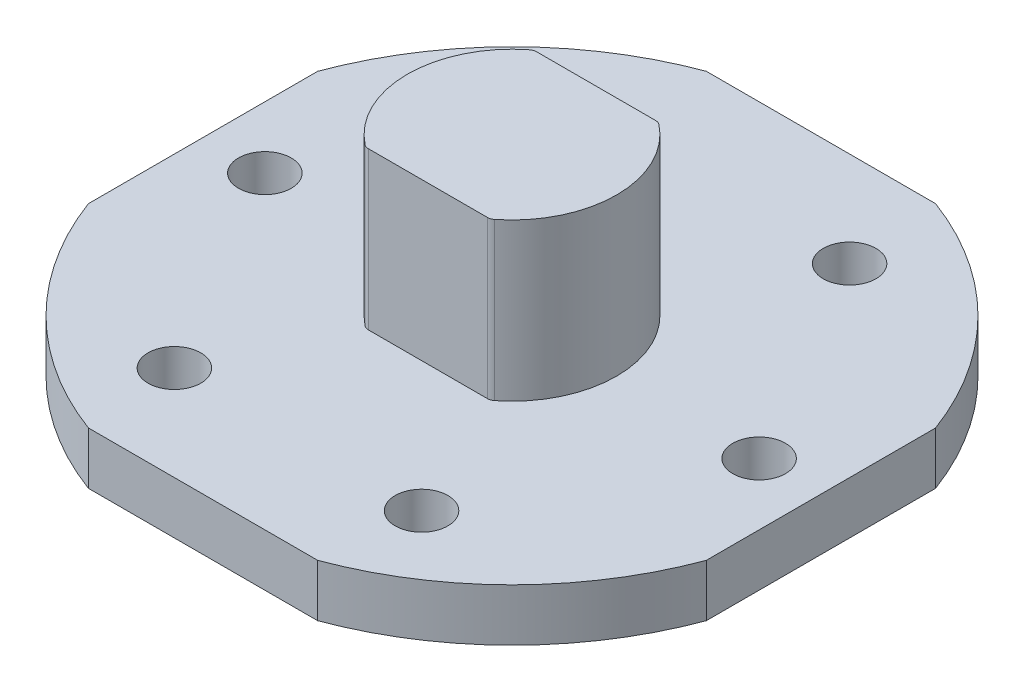
ISO-10303-21;
HEADER;
FILE_DESCRIPTION(('STEP AP214'),'2;1');
FILE_NAME('part.step','',(''),(''),'','','');
FILE_SCHEMA(('AUTOMOTIVE_DESIGN { 1 0 10303 214 1 1 1 1 }'));
ENDSEC;
DATA;
#1=APPLICATION_CONTEXT('core data for automotive mechanical design processes');
#2=APPLICATION_PROTOCOL_DEFINITION('international standard','automotive_design',2000,#1);
#3=PRODUCT_CONTEXT('',#1,'mechanical');
#4=PRODUCT('Part','Part','',(#3));
#5=PRODUCT_RELATED_PRODUCT_CATEGORY('part','',(#4));
#6=PRODUCT_DEFINITION_FORMATION('','',#4);
#7=PRODUCT_DEFINITION_CONTEXT('part definition',#1,'design');
#8=PRODUCT_DEFINITION('design','',#6,#7);
#9=PRODUCT_DEFINITION_SHAPE('','',#8);
#10=(LENGTH_UNIT() NAMED_UNIT(*) SI_UNIT(.MILLI.,.METRE.));
#11=(NAMED_UNIT(*) PLANE_ANGLE_UNIT() SI_UNIT($,.RADIAN.));
#12=(NAMED_UNIT(*) SI_UNIT($,.STERADIAN.) SOLID_ANGLE_UNIT());
#13=UNCERTAINTY_MEASURE_WITH_UNIT(LENGTH_MEASURE(1.E-05),#10,'distance_accuracy_value','');
#14=(GEOMETRIC_REPRESENTATION_CONTEXT(3) GLOBAL_UNCERTAINTY_ASSIGNED_CONTEXT((#13)) GLOBAL_UNIT_ASSIGNED_CONTEXT((#10,
#11,#12)) REPRESENTATION_CONTEXT('',''));
#15=CARTESIAN_POINT('',(0.,0.,0.));
#16=DIRECTION('',(0.,0.,1.));
#17=DIRECTION('',(1.,0.,0.));
#18=AXIS2_PLACEMENT_3D('',#15,#16,#17);
#19=CARTESIAN_POINT('',(0.,19.05,10.2));
#20=DIRECTION('',(0.,0.,-1.));
#21=DIRECTION('',(-1.,0.,0.));
#22=AXIS2_PLACEMENT_3D('',#19,#20,#21);
#23=PLANE('',#22);
#24=DIRECTION('',(1.,0.,0.));
#25=VECTOR('',#24,1.);
#26=CARTESIAN_POINT('',(0.,19.05,10.2));
#27=LINE('',#26,#25);
#28=CARTESIAN_POINT('',(-7.22841614740049,19.05,10.2));
#29=VERTEX_POINT('',#28);
#30=CARTESIAN_POINT('',(7.22841614740049,19.05,10.2));
#31=VERTEX_POINT('',#30);
#32=EDGE_CURVE('E277',#29,#31,#27,.T.);
#33=ORIENTED_EDGE('',*,*,#32,.F.);
#34=DIRECTION('',(0.,-1.,0.));
#35=VECTOR('',#34,1.);
#36=CARTESIAN_POINT('',(-7.22841614740049,19.05,10.2));
#37=LINE('',#36,#35);
#38=CARTESIAN_POINT('',(-7.22841614740049,0.,10.2));
#39=VERTEX_POINT('',#38);
#40=EDGE_CURVE('E343',#29,#39,#37,.T.);
#41=ORIENTED_EDGE('',*,*,#40,.T.);
#42=DIRECTION('',(1.,0.,0.));
#43=VECTOR('',#42,1.);
#44=CARTESIAN_POINT('',(0.,0.,10.2));
#45=LINE('',#44,#43);
#46=CARTESIAN_POINT('',(7.22841614740049,0.,10.2));
#47=VERTEX_POINT('',#46);
#48=EDGE_CURVE('E259',#39,#47,#45,.T.);
#49=ORIENTED_EDGE('',*,*,#48,.T.);
#50=DIRECTION('',(0.,-1.,0.));
#51=VECTOR('',#50,1.);
#52=CARTESIAN_POINT('',(7.22841614740049,19.05,10.2));
#53=LINE('',#52,#51);
#54=EDGE_CURVE('E340',#47,#31,#53,.F.);
#55=ORIENTED_EDGE('',*,*,#54,.T.);
#56=EDGE_LOOP('',(#33,#41,#49,#55));
#57=FACE_BOUND('',#56,.T.);
#58=ADVANCED_FACE('F77',(#57),#23,.F.);
#59=CARTESIAN_POINT('',(0.,19.05,0.));
#60=DIRECTION('',(0.,-1.,0.));
#61=DIRECTION('',(0.,0.,-1.));
#62=AXIS2_PLACEMENT_3D('',#59,#60,#61);
#63=CYLINDRICAL_SURFACE('',#62,12.7);
#64=CARTESIAN_POINT('',(0.,0.,0.));
#65=DIRECTION('',(0.,1.,0.));
#66=DIRECTION('',(0.,0.,1.));
#67=AXIS2_PLACEMENT_3D('',#64,#65,#66);
#68=CIRCLE('',#67,12.7);
#69=CARTESIAN_POINT('',(7.84622949333215,0.,9.98632478632478));
#70=VERTEX_POINT('',#69);
#71=CARTESIAN_POINT('',(7.84622949333215,0.,-9.98632478632478));
#72=VERTEX_POINT('',#71);
#73=EDGE_CURVE('E297',#70,#72,#68,.T.);
#74=ORIENTED_EDGE('',*,*,#73,.T.);
#75=DIRECTION('',(0.,-1.,0.));
#76=VECTOR('',#75,1.);
#77=CARTESIAN_POINT('',(7.84622949333215,19.05,-9.98632478632478));
#78=LINE('',#77,#76);
#79=CARTESIAN_POINT('',(7.84622949333215,19.05,-9.98632478632478));
#80=VERTEX_POINT('',#79);
#81=EDGE_CURVE('E337',#72,#80,#78,.F.);
#82=ORIENTED_EDGE('',*,*,#81,.T.);
#83=CARTESIAN_POINT('',(0.,19.05,0.));
#84=DIRECTION('',(0.,1.,0.));
#85=DIRECTION('',(0.,0.,1.));
#86=AXIS2_PLACEMENT_3D('',#83,#84,#85);
#87=CIRCLE('',#86,12.7);
#88=CARTESIAN_POINT('',(7.84622949333215,19.05,9.98632478632478));
#89=VERTEX_POINT('',#88);
#90=EDGE_CURVE('E281',#89,#80,#87,.T.);
#91=ORIENTED_EDGE('',*,*,#90,.F.);
#92=DIRECTION('',(0.,-1.,0.));
#93=VECTOR('',#92,1.);
#94=CARTESIAN_POINT('',(7.84622949333215,19.05,9.98632478632478));
#95=LINE('',#94,#93);
#96=EDGE_CURVE('E333',#89,#70,#95,.T.);
#97=ORIENTED_EDGE('',*,*,#96,.T.);
#98=EDGE_LOOP('',(#74,#82,#91,#97));
#99=FACE_BOUND('',#98,.T.);
#100=ADVANCED_FACE('F373',(#99),#63,.T.);
#101=CARTESIAN_POINT('',(0.,19.05,-10.2));
#102=DIRECTION('',(0.,0.,-1.));
#103=DIRECTION('',(-1.,0.,0.));
#104=AXIS2_PLACEMENT_3D('',#101,#102,#103);
#105=PLANE('',#104);
#106=DIRECTION('',(1.,0.,0.));
#107=VECTOR('',#106,1.);
#108=CARTESIAN_POINT('',(0.,0.,-10.2));
#109=LINE('',#108,#107);
#110=CARTESIAN_POINT('',(-7.22841614740049,0.,-10.2));
#111=VERTEX_POINT('',#110);
#112=CARTESIAN_POINT('',(7.22841614740049,0.,-10.2));
#113=VERTEX_POINT('',#112);
#114=EDGE_CURVE('E301',#111,#113,#109,.T.);
#115=ORIENTED_EDGE('',*,*,#114,.F.);
#116=DIRECTION('',(0.,1.,0.));
#117=VECTOR('',#116,1.);
#118=CARTESIAN_POINT('',(-7.22841614740049,19.05,-10.2));
#119=LINE('',#118,#117);
#120=CARTESIAN_POINT('',(-7.22841614740049,19.05,-10.2));
#121=VERTEX_POINT('',#120);
#122=EDGE_CURVE('E318',#111,#121,#119,.T.);
#123=ORIENTED_EDGE('',*,*,#122,.T.);
#124=DIRECTION('',(1.,0.,0.));
#125=VECTOR('',#124,1.);
#126=CARTESIAN_POINT('',(0.,19.05,-10.2));
#127=LINE('',#126,#125);
#128=CARTESIAN_POINT('',(7.22841614740049,19.05,-10.2));
#129=VERTEX_POINT('',#128);
#130=EDGE_CURVE('E286',#121,#129,#127,.T.);
#131=ORIENTED_EDGE('',*,*,#130,.T.);
#132=DIRECTION('',(0.,1.,0.));
#133=VECTOR('',#132,1.);
#134=CARTESIAN_POINT('',(7.22841614740049,0.,-10.2));
#135=LINE('',#134,#133);
#136=EDGE_CURVE('E314',#129,#113,#135,.F.);
#137=ORIENTED_EDGE('',*,*,#136,.T.);
#138=EDGE_LOOP('',(#115,#123,#131,#137));
#139=FACE_BOUND('',#138,.T.);
#140=ADVANCED_FACE('F381',(#139),#105,.T.);
#141=CARTESIAN_POINT('',(0.,19.05,0.));
#142=DIRECTION('',(0.,-1.,0.));
#143=DIRECTION('',(0.,0.,-1.));
#144=AXIS2_PLACEMENT_3D('',#141,#142,#143);
#145=CYLINDRICAL_SURFACE('',#144,12.7);
#146=CARTESIAN_POINT('',(0.,19.05,0.));
#147=DIRECTION('',(0.,1.,0.));
#148=DIRECTION('',(0.,0.,1.));
#149=AXIS2_PLACEMENT_3D('',#146,#147,#148);
#150=CIRCLE('',#149,12.7);
#151=CARTESIAN_POINT('',(-7.84622949333215,19.05,-9.98632478632478));
#152=VERTEX_POINT('',#151);
#153=CARTESIAN_POINT('',(-7.84622949333215,19.05,9.98632478632478));
#154=VERTEX_POINT('',#153);
#155=EDGE_CURVE('E290',#152,#154,#150,.T.);
#156=ORIENTED_EDGE('',*,*,#155,.F.);
#157=DIRECTION('',(0.,-1.,0.));
#158=VECTOR('',#157,1.);
#159=CARTESIAN_POINT('',(-7.84622949333215,19.05,-9.98632478632478));
#160=LINE('',#159,#158);
#161=CARTESIAN_POINT('',(-7.84622949333215,0.,-9.98632478632478));
#162=VERTEX_POINT('',#161);
#163=EDGE_CURVE('E310',#152,#162,#160,.T.);
#164=ORIENTED_EDGE('',*,*,#163,.T.);
#165=CARTESIAN_POINT('',(0.,0.,0.));
#166=DIRECTION('',(0.,1.,0.));
#167=DIRECTION('',(0.,0.,1.));
#168=AXIS2_PLACEMENT_3D('',#165,#166,#167);
#169=CIRCLE('',#168,12.7);
#170=CARTESIAN_POINT('',(-7.84622949333215,0.,9.98632478632478));
#171=VERTEX_POINT('',#170);
#172=EDGE_CURVE('E282',#162,#171,#169,.T.);
#173=ORIENTED_EDGE('',*,*,#172,.T.);
#174=DIRECTION('',(0.,-1.,0.));
#175=VECTOR('',#174,1.);
#176=CARTESIAN_POINT('',(-7.84622949333215,19.05,9.98632478632478));
#177=LINE('',#176,#175);
#178=EDGE_CURVE('E294',#171,#154,#177,.F.);
#179=ORIENTED_EDGE('',*,*,#178,.T.);
#180=EDGE_LOOP('',(#156,#164,#173,#179));
#181=FACE_BOUND('',#180,.T.);
#182=ADVANCED_FACE('F357',(#181),#145,.T.);
#183=CARTESIAN_POINT('',(0.,19.05,0.));
#184=DIRECTION('',(0.,1.,0.));
#185=DIRECTION('',(0.,0.,1.));
#186=AXIS2_PLACEMENT_3D('',#183,#184,#185);
#187=PLANE('',#186);
#188=ORIENTED_EDGE('',*,*,#130,.F.);
#189=CARTESIAN_POINT('',(-7.22841614740049,19.05,-9.2));
#190=DIRECTION('',(0.,1.,0.));
#191=DIRECTION('',(0.,0.,1.));
#192=AXIS2_PLACEMENT_3D('',#189,#190,#191);
#193=CIRCLE('',#192,1.);
#194=EDGE_CURVE('E330',#121,#152,#193,.T.);
#195=ORIENTED_EDGE('',*,*,#194,.T.);
#196=ORIENTED_EDGE('',*,*,#155,.T.);
#197=CARTESIAN_POINT('',(-7.22841614740049,19.05,9.2));
#198=DIRECTION('',(0.,1.,0.));
#199=DIRECTION('',(0.,0.,1.));
#200=AXIS2_PLACEMENT_3D('',#197,#198,#199);
#201=CIRCLE('',#200,1.);
#202=EDGE_CURVE('E324',#154,#29,#201,.T.);
#203=ORIENTED_EDGE('',*,*,#202,.T.);
#204=ORIENTED_EDGE('',*,*,#32,.T.);
#205=CARTESIAN_POINT('',(7.22841614740049,19.05,9.2));
#206=DIRECTION('',(0.,1.,0.));
#207=DIRECTION('',(0.,0.,1.));
#208=AXIS2_PLACEMENT_3D('',#205,#206,#207);
#209=CIRCLE('',#208,1.);
#210=EDGE_CURVE('E321',#31,#89,#209,.T.);
#211=ORIENTED_EDGE('',*,*,#210,.T.);
#212=ORIENTED_EDGE('',*,*,#90,.T.);
#213=CARTESIAN_POINT('',(7.22841614740049,19.05,-9.2));
#214=DIRECTION('',(0.,1.,0.));
#215=DIRECTION('',(0.,0.,1.));
#216=AXIS2_PLACEMENT_3D('',#213,#214,#215);
#217=CIRCLE('',#216,1.);
#218=EDGE_CURVE('E327',#80,#129,#217,.T.);
#219=ORIENTED_EDGE('',*,*,#218,.T.);
#220=EDGE_LOOP('',(#188,#195,#196,#203,#204,#211,#212,#219));
#221=FACE_BOUND('',#220,.T.);
#222=ADVANCED_FACE('F364',(#221),#187,.T.);
#223=CARTESIAN_POINT('',(0.,-6.35,0.));
#224=DIRECTION('',(0.,1.,0.));
#225=DIRECTION('',(0.,0.,1.));
#226=AXIS2_PLACEMENT_3D('',#223,#224,#225);
#227=CYLINDRICAL_SURFACE('',#226,40.);
#228=CARTESIAN_POINT('',(0.,0.,0.));
#229=DIRECTION('',(0.,1.,0.));
#230=DIRECTION('',(0.,0.,1.));
#231=AXIS2_PLACEMENT_3D('',#228,#229,#230);
#232=CIRCLE('',#231,40.);
#233=CARTESIAN_POINT('',(-37.5,0.,13.9194109070751));
#234=VERTEX_POINT('',#233);
#235=CARTESIAN_POINT('',(-13.9194109070751,0.,37.5));
#236=VERTEX_POINT('',#235);
#237=EDGE_CURVE('E220',#234,#236,#232,.T.);
#238=ORIENTED_EDGE('',*,*,#237,.F.);
#239=DIRECTION('',(0.,1.,0.));
#240=VECTOR('',#239,1.);
#241=CARTESIAN_POINT('',(-37.5,-6.35,13.9194109070751));
#242=LINE('',#241,#240);
#243=CARTESIAN_POINT('',(-37.5,-6.35,13.9194109070751));
#244=VERTEX_POINT('',#243);
#245=EDGE_CURVE('E260',#244,#234,#242,.T.);
#246=ORIENTED_EDGE('',*,*,#245,.F.);
#247=CARTESIAN_POINT('',(0.,-6.35,0.));
#248=DIRECTION('',(0.,1.,0.));
#249=DIRECTION('',(0.,0.,1.));
#250=AXIS2_PLACEMENT_3D('',#247,#248,#249);
#251=CIRCLE('',#250,40.);
#252=CARTESIAN_POINT('',(-13.9194109070751,-6.35,37.5));
#253=VERTEX_POINT('',#252);
#254=EDGE_CURVE('E202',#244,#253,#251,.T.);
#255=ORIENTED_EDGE('',*,*,#254,.T.);
#256=DIRECTION('',(0.,1.,0.));
#257=VECTOR('',#256,1.);
#258=CARTESIAN_POINT('',(-13.9194109070751,-6.35,37.5));
#259=LINE('',#258,#257);
#260=EDGE_CURVE('E218',#253,#236,#259,.T.);
#261=ORIENTED_EDGE('',*,*,#260,.T.);
#262=EDGE_LOOP('',(#238,#246,#255,#261));
#263=FACE_BOUND('',#262,.T.);
#264=ADVANCED_FACE('F409',(#263),#227,.T.);
#265=CARTESIAN_POINT('',(-37.5,-6.35,0.));
#266=DIRECTION('',(-1.,0.,0.));
#267=DIRECTION('',(0.,0.,1.));
#268=AXIS2_PLACEMENT_3D('',#265,#266,#267);
#269=PLANE('',#268);
#270=DIRECTION('',(0.,0.,1.));
#271=VECTOR('',#270,1.);
#272=CARTESIAN_POINT('',(-37.5,0.,0.));
#273=LINE('',#272,#271);
#274=CARTESIAN_POINT('',(-37.5,0.,-13.9194109070751));
#275=VERTEX_POINT('',#274);
#276=EDGE_CURVE('E224',#275,#234,#273,.T.);
#277=ORIENTED_EDGE('',*,*,#276,.F.);
#278=DIRECTION('',(0.,1.,0.));
#279=VECTOR('',#278,1.);
#280=CARTESIAN_POINT('',(-37.5,-6.35,-13.9194109070751));
#281=LINE('',#280,#279);
#282=CARTESIAN_POINT('',(-37.5,-6.35,-13.9194109070751));
#283=VERTEX_POINT('',#282);
#284=EDGE_CURVE('E263',#283,#275,#281,.T.);
#285=ORIENTED_EDGE('',*,*,#284,.F.);
#286=DIRECTION('',(0.,0.,1.));
#287=VECTOR('',#286,1.);
#288=CARTESIAN_POINT('',(-37.5,-6.35,0.));
#289=LINE('',#288,#287);
#290=EDGE_CURVE('E237',#283,#244,#289,.T.);
#291=ORIENTED_EDGE('',*,*,#290,.T.);
#292=ORIENTED_EDGE('',*,*,#245,.T.);
#293=EDGE_LOOP('',(#277,#285,#291,#292));
#294=FACE_BOUND('',#293,.T.);
#295=ADVANCED_FACE('F422',(#294),#269,.T.);
#296=CARTESIAN_POINT('',(-13.9194109070751,0.,-37.5));
#297=VERTEX_POINT('',#296);
#298=EDGE_CURVE('E226',#297,#275,#232,.T.);
#299=ORIENTED_EDGE('',*,*,#298,.F.);
#300=DIRECTION('',(0.,1.,0.));
#301=VECTOR('',#300,1.);
#302=CARTESIAN_POINT('',(-13.9194109070751,-6.35,-37.5));
#303=LINE('',#302,#301);
#304=CARTESIAN_POINT('',(-13.9194109070751,-6.35,-37.5));
#305=VERTEX_POINT('',#304);
#306=EDGE_CURVE('E266',#305,#297,#303,.T.);
#307=ORIENTED_EDGE('',*,*,#306,.F.);
#308=EDGE_CURVE('E236',#305,#283,#251,.T.);
#309=ORIENTED_EDGE('',*,*,#308,.T.);
#310=ORIENTED_EDGE('',*,*,#284,.T.);
#311=EDGE_LOOP('',(#299,#307,#309,#310));
#312=FACE_BOUND('',#311,.T.);
#313=ADVANCED_FACE('F420',(#312),#227,.T.);
#314=CARTESIAN_POINT('',(0.,-6.35,-37.5));
#315=DIRECTION('',(0.,0.,1.));
#316=DIRECTION('',(1.,0.,0.));
#317=AXIS2_PLACEMENT_3D('',#314,#315,#316);
#318=PLANE('',#317);
#319=DIRECTION('',(1.,0.,0.));
#320=VECTOR('',#319,1.);
#321=CARTESIAN_POINT('',(0.,0.,-37.5));
#322=LINE('',#321,#320);
#323=CARTESIAN_POINT('',(13.9194109070751,0.,-37.5));
#324=VERTEX_POINT('',#323);
#325=EDGE_CURVE('E250',#297,#324,#322,.T.);
#326=ORIENTED_EDGE('',*,*,#325,.T.);
#327=DIRECTION('',(0.,1.,0.));
#328=VECTOR('',#327,1.);
#329=CARTESIAN_POINT('',(13.9194109070751,-6.35,-37.5));
#330=LINE('',#329,#328);
#331=CARTESIAN_POINT('',(13.9194109070751,-6.35,-37.5));
#332=VERTEX_POINT('',#331);
#333=EDGE_CURVE('E269',#332,#324,#330,.T.);
#334=ORIENTED_EDGE('',*,*,#333,.F.);
#335=DIRECTION('',(1.,0.,0.));
#336=VECTOR('',#335,1.);
#337=CARTESIAN_POINT('',(0.,-6.35,-37.5));
#338=LINE('',#337,#336);
#339=EDGE_CURVE('E233',#305,#332,#338,.T.);
#340=ORIENTED_EDGE('',*,*,#339,.F.);
#341=ORIENTED_EDGE('',*,*,#306,.T.);
#342=EDGE_LOOP('',(#326,#334,#340,#341));
#343=FACE_BOUND('',#342,.T.);
#344=ADVANCED_FACE('F417',(#343),#318,.F.);
#345=CARTESIAN_POINT('',(37.5,0.,-13.9194109070751));
#346=VERTEX_POINT('',#345);
#347=EDGE_CURVE('E246',#346,#324,#232,.T.);
#348=ORIENTED_EDGE('',*,*,#347,.F.);
#349=DIRECTION('',(0.,1.,0.));
#350=VECTOR('',#349,1.);
#351=CARTESIAN_POINT('',(37.5,-6.35,-13.9194109070751));
#352=LINE('',#351,#350);
#353=CARTESIAN_POINT('',(37.5,-6.35,-13.9194109070751));
#354=VERTEX_POINT('',#353);
#355=EDGE_CURVE('E272',#354,#346,#352,.T.);
#356=ORIENTED_EDGE('',*,*,#355,.F.);
#357=EDGE_CURVE('E216',#354,#332,#251,.T.);
#358=ORIENTED_EDGE('',*,*,#357,.T.);
#359=ORIENTED_EDGE('',*,*,#333,.T.);
#360=EDGE_LOOP('',(#348,#356,#358,#359));
#361=FACE_BOUND('',#360,.T.);
#362=ADVANCED_FACE('F415',(#361),#227,.T.);
#363=CARTESIAN_POINT('',(37.5,-6.35,0.));
#364=DIRECTION('',(-1.,0.,0.));
#365=DIRECTION('',(0.,0.,1.));
#366=AXIS2_PLACEMENT_3D('',#363,#364,#365);
#367=PLANE('',#366);
#368=DIRECTION('',(0.,0.,1.));
#369=VECTOR('',#368,1.);
#370=CARTESIAN_POINT('',(37.5,0.,0.));
#371=LINE('',#370,#369);
#372=CARTESIAN_POINT('',(37.5,0.,13.9194109070751));
#373=VERTEX_POINT('',#372);
#374=EDGE_CURVE('E245',#346,#373,#371,.T.);
#375=ORIENTED_EDGE('',*,*,#374,.T.);
#376=DIRECTION('',(0.,1.,0.));
#377=VECTOR('',#376,1.);
#378=CARTESIAN_POINT('',(37.5,-6.35,13.9194109070751));
#379=LINE('',#378,#377);
#380=CARTESIAN_POINT('',(37.5,-6.35,13.9194109070751));
#381=VERTEX_POINT('',#380);
#382=EDGE_CURVE('E201',#381,#373,#379,.T.);
#383=ORIENTED_EDGE('',*,*,#382,.F.);
#384=DIRECTION('',(0.,0.,1.));
#385=VECTOR('',#384,1.);
#386=CARTESIAN_POINT('',(37.5,-6.35,0.));
#387=LINE('',#386,#385);
#388=EDGE_CURVE('E212',#354,#381,#387,.T.);
#389=ORIENTED_EDGE('',*,*,#388,.F.);
#390=ORIENTED_EDGE('',*,*,#355,.T.);
#391=EDGE_LOOP('',(#375,#383,#389,#390));
#392=FACE_BOUND('',#391,.T.);
#393=ADVANCED_FACE('F412',(#392),#367,.F.);
#394=CARTESIAN_POINT('',(13.9194109070751,0.,37.5));
#395=VERTEX_POINT('',#394);
#396=EDGE_CURVE('E195',#395,#373,#232,.T.);
#397=ORIENTED_EDGE('',*,*,#396,.F.);
#398=DIRECTION('',(0.,1.,0.));
#399=VECTOR('',#398,1.);
#400=CARTESIAN_POINT('',(13.9194109070751,-6.35,37.5));
#401=LINE('',#400,#399);
#402=CARTESIAN_POINT('',(13.9194109070751,-6.35,37.5));
#403=VERTEX_POINT('',#402);
#404=EDGE_CURVE('E190',#403,#395,#401,.T.);
#405=ORIENTED_EDGE('',*,*,#404,.F.);
#406=EDGE_CURVE('E193',#403,#381,#251,.T.);
#407=ORIENTED_EDGE('',*,*,#406,.T.);
#408=ORIENTED_EDGE('',*,*,#382,.T.);
#409=EDGE_LOOP('',(#397,#405,#407,#408));
#410=FACE_BOUND('',#409,.T.);
#411=ADVANCED_FACE('F192',(#410),#227,.T.);
#412=CARTESIAN_POINT('',(0.,-6.35,37.5));
#413=DIRECTION('',(0.,0.,1.));
#414=DIRECTION('',(1.,0.,0.));
#415=AXIS2_PLACEMENT_3D('',#412,#413,#414);
#416=PLANE('',#415);
#417=DIRECTION('',(1.,0.,0.));
#418=VECTOR('',#417,1.);
#419=CARTESIAN_POINT('',(0.,0.,37.5));
#420=LINE('',#419,#418);
#421=EDGE_CURVE('E241',#236,#395,#420,.T.);
#422=ORIENTED_EDGE('',*,*,#421,.F.);
#423=ORIENTED_EDGE('',*,*,#260,.F.);
#424=DIRECTION('',(1.,0.,0.));
#425=VECTOR('',#424,1.);
#426=CARTESIAN_POINT('',(0.,-6.35,37.5));
#427=LINE('',#426,#425);
#428=EDGE_CURVE('E208',#253,#403,#427,.T.);
#429=ORIENTED_EDGE('',*,*,#428,.T.);
#430=ORIENTED_EDGE('',*,*,#404,.T.);
#431=EDGE_LOOP('',(#422,#423,#429,#430));
#432=FACE_BOUND('',#431,.T.);
#433=ADVANCED_FACE('F217',(#432),#416,.T.);
#434=CARTESIAN_POINT('',(0.,0.,0.));
#435=DIRECTION('',(0.,1.,0.));
#436=DIRECTION('',(0.,0.,1.));
#437=AXIS2_PLACEMENT_3D('',#434,#435,#436);
#438=PLANE('',#437);
#439=CARTESIAN_POINT('',(-30.,0.,0.));
#440=DIRECTION('',(0.,1.,0.));
#441=DIRECTION('',(0.,0.,1.));
#442=AXIS2_PLACEMENT_3D('',#439,#440,#441);
#443=CIRCLE('',#442,3.2);
#444=CARTESIAN_POINT('',(-30.,0.,3.2));
#445=VERTEX_POINT('',#444);
#446=EDGE_CURVE('E471',#445,#445,#443,.T.);
#447=ORIENTED_EDGE('',*,*,#446,.F.);
#448=EDGE_LOOP('',(#447));
#449=FACE_BOUND('',#448,.T.);
#450=CARTESIAN_POINT('',(-15.,0.,-25.9807621135332));
#451=DIRECTION('',(0.,1.,0.));
#452=DIRECTION('',(0.,0.,1.));
#453=AXIS2_PLACEMENT_3D('',#450,#451,#452);
#454=CIRCLE('',#453,3.2);
#455=CARTESIAN_POINT('',(-15.,0.,-22.7807621135332));
#456=VERTEX_POINT('',#455);
#457=EDGE_CURVE('E461',#456,#456,#454,.T.);
#458=ORIENTED_EDGE('',*,*,#457,.F.);
#459=EDGE_LOOP('',(#458));
#460=FACE_BOUND('',#459,.T.);
#461=CARTESIAN_POINT('',(15.,0.,-25.9807621135332));
#462=DIRECTION('',(0.,1.,0.));
#463=DIRECTION('',(0.,0.,1.));
#464=AXIS2_PLACEMENT_3D('',#461,#462,#463);
#465=CIRCLE('',#464,3.2);
#466=CARTESIAN_POINT('',(15.,0.,-22.7807621135332));
#467=VERTEX_POINT('',#466);
#468=EDGE_CURVE('E468',#467,#467,#465,.T.);
#469=ORIENTED_EDGE('',*,*,#468,.F.);
#470=EDGE_LOOP('',(#469));
#471=FACE_BOUND('',#470,.T.);
#472=CARTESIAN_POINT('',(30.,0.,0.));
#473=DIRECTION('',(0.,1.,0.));
#474=DIRECTION('',(0.,0.,1.));
#475=AXIS2_PLACEMENT_3D('',#472,#473,#474);
#476=CIRCLE('',#475,3.2);
#477=CARTESIAN_POINT('',(30.,0.,3.2));
#478=VERTEX_POINT('',#477);
#479=EDGE_CURVE('E482',#478,#478,#476,.T.);
#480=ORIENTED_EDGE('',*,*,#479,.F.);
#481=EDGE_LOOP('',(#480));
#482=FACE_BOUND('',#481,.T.);
#483=CARTESIAN_POINT('',(15.,0.,25.9807621135332));
#484=DIRECTION('',(0.,1.,0.));
#485=DIRECTION('',(0.,0.,1.));
#486=AXIS2_PLACEMENT_3D('',#483,#484,#485);
#487=CIRCLE('',#486,3.2);
#488=CARTESIAN_POINT('',(15.,0.,29.1807621135332));
#489=VERTEX_POINT('',#488);
#490=EDGE_CURVE('E490',#489,#489,#487,.T.);
#491=ORIENTED_EDGE('',*,*,#490,.F.);
#492=EDGE_LOOP('',(#491));
#493=FACE_BOUND('',#492,.T.);
#494=CARTESIAN_POINT('',(-15.,0.,25.9807621135332));
#495=DIRECTION('',(0.,1.,0.));
#496=DIRECTION('',(0.,0.,1.));
#497=AXIS2_PLACEMENT_3D('',#494,#495,#496);
#498=CIRCLE('',#497,3.2);
#499=CARTESIAN_POINT('',(-15.,0.,29.1807621135332));
#500=VERTEX_POINT('',#499);
#501=EDGE_CURVE('E497',#500,#500,#498,.T.);
#502=ORIENTED_EDGE('',*,*,#501,.F.);
#503=EDGE_LOOP('',(#502));
#504=FACE_BOUND('',#503,.T.);
#505=ORIENTED_EDGE('',*,*,#48,.F.);
#506=CARTESIAN_POINT('',(-7.22841614740049,0.,9.2));
#507=DIRECTION('',(0.,1.,0.));
#508=DIRECTION('',(0.,0.,1.));
#509=AXIS2_PLACEMENT_3D('',#506,#507,#508);
#510=CIRCLE('',#509,1.);
#511=EDGE_CURVE('E86',#39,#171,#510,.F.);
#512=ORIENTED_EDGE('',*,*,#511,.T.);
#513=ORIENTED_EDGE('',*,*,#172,.F.);
#514=CARTESIAN_POINT('',(-7.22841614740049,0.,-9.2));
#515=DIRECTION('',(0.,1.,0.));
#516=DIRECTION('',(0.,0.,1.));
#517=AXIS2_PLACEMENT_3D('',#514,#515,#516);
#518=CIRCLE('',#517,1.);
#519=EDGE_CURVE('E346',#162,#111,#518,.F.);
#520=ORIENTED_EDGE('',*,*,#519,.T.);
#521=ORIENTED_EDGE('',*,*,#114,.T.);
#522=CARTESIAN_POINT('',(7.22841614740049,0.,-9.2));
#523=DIRECTION('',(0.,1.,0.));
#524=DIRECTION('',(0.,0.,1.));
#525=AXIS2_PLACEMENT_3D('',#522,#523,#524);
#526=CIRCLE('',#525,1.);
#527=EDGE_CURVE('E349',#113,#72,#526,.F.);
#528=ORIENTED_EDGE('',*,*,#527,.T.);
#529=ORIENTED_EDGE('',*,*,#73,.F.);
#530=CARTESIAN_POINT('',(7.22841614740049,0.,9.2));
#531=DIRECTION('',(0.,1.,0.));
#532=DIRECTION('',(0.,0.,1.));
#533=AXIS2_PLACEMENT_3D('',#530,#531,#532);
#534=CIRCLE('',#533,1.);
#535=EDGE_CURVE('E12',#70,#47,#534,.F.);
#536=ORIENTED_EDGE('',*,*,#535,.T.);
#537=EDGE_LOOP('',(#505,#512,#513,#520,#521,#528,#529,#536));
#538=FACE_BOUND('',#537,.T.);
#539=ORIENTED_EDGE('',*,*,#421,.T.);
#540=ORIENTED_EDGE('',*,*,#396,.T.);
#541=ORIENTED_EDGE('',*,*,#374,.F.);
#542=ORIENTED_EDGE('',*,*,#347,.T.);
#543=ORIENTED_EDGE('',*,*,#325,.F.);
#544=ORIENTED_EDGE('',*,*,#298,.T.);
#545=ORIENTED_EDGE('',*,*,#276,.T.);
#546=ORIENTED_EDGE('',*,*,#237,.T.);
#547=EDGE_LOOP('',(#539,#540,#541,#542,#543,#544,#545,#546));
#548=FACE_BOUND('',#547,.T.);
#549=ADVANCED_FACE('F353',(#449,#460,#471,#482,#493,#504,#538,#548),#438,.T.);
#550=CARTESIAN_POINT('',(0.,-6.35,0.));
#551=DIRECTION('',(0.,1.,0.));
#552=DIRECTION('',(0.,0.,1.));
#553=AXIS2_PLACEMENT_3D('',#550,#551,#552);
#554=PLANE('',#553);
#555=CARTESIAN_POINT('',(-30.,-6.35,0.));
#556=DIRECTION('',(0.,1.,0.));
#557=DIRECTION('',(0.,0.,1.));
#558=AXIS2_PLACEMENT_3D('',#555,#556,#557);
#559=CIRCLE('',#558,3.2);
#560=CARTESIAN_POINT('',(-30.,-6.35,3.2));
#561=VERTEX_POINT('',#560);
#562=EDGE_CURVE('E464',#561,#561,#559,.T.);
#563=ORIENTED_EDGE('',*,*,#562,.T.);
#564=EDGE_LOOP('',(#563));
#565=FACE_BOUND('',#564,.T.);
#566=CARTESIAN_POINT('',(-15.,-6.35,-25.9807621135332));
#567=DIRECTION('',(0.,1.,0.));
#568=DIRECTION('',(0.,0.,1.));
#569=AXIS2_PLACEMENT_3D('',#566,#567,#568);
#570=CIRCLE('',#569,3.2);
#571=CARTESIAN_POINT('',(-15.,-6.35,-22.7807621135332));
#572=VERTEX_POINT('',#571);
#573=EDGE_CURVE('E458',#572,#572,#570,.T.);
#574=ORIENTED_EDGE('',*,*,#573,.T.);
#575=EDGE_LOOP('',(#574));
#576=FACE_BOUND('',#575,.T.);
#577=CARTESIAN_POINT('',(15.,-6.35,-25.9807621135332));
#578=DIRECTION('',(0.,1.,0.));
#579=DIRECTION('',(0.,0.,1.));
#580=AXIS2_PLACEMENT_3D('',#577,#578,#579);
#581=CIRCLE('',#580,3.2);
#582=CARTESIAN_POINT('',(15.,-6.35,-22.7807621135332));
#583=VERTEX_POINT('',#582);
#584=EDGE_CURVE('E478',#583,#583,#581,.T.);
#585=ORIENTED_EDGE('',*,*,#584,.T.);
#586=EDGE_LOOP('',(#585));
#587=FACE_BOUND('',#586,.T.);
#588=CARTESIAN_POINT('',(30.,-6.35,0.));
#589=DIRECTION('',(0.,1.,0.));
#590=DIRECTION('',(0.,0.,1.));
#591=AXIS2_PLACEMENT_3D('',#588,#589,#590);
#592=CIRCLE('',#591,3.2);
#593=CARTESIAN_POINT('',(30.,-6.35,3.2));
#594=VERTEX_POINT('',#593);
#595=EDGE_CURVE('E486',#594,#594,#592,.T.);
#596=ORIENTED_EDGE('',*,*,#595,.T.);
#597=EDGE_LOOP('',(#596));
#598=FACE_BOUND('',#597,.T.);
#599=CARTESIAN_POINT('',(15.,-6.35,25.9807621135332));
#600=DIRECTION('',(0.,1.,0.));
#601=DIRECTION('',(0.,0.,1.));
#602=AXIS2_PLACEMENT_3D('',#599,#600,#601);
#603=CIRCLE('',#602,3.2);
#604=CARTESIAN_POINT('',(15.,-6.35,29.1807621135332));
#605=VERTEX_POINT('',#604);
#606=EDGE_CURVE('E494',#605,#605,#603,.T.);
#607=ORIENTED_EDGE('',*,*,#606,.T.);
#608=EDGE_LOOP('',(#607));
#609=FACE_BOUND('',#608,.T.);
#610=CARTESIAN_POINT('',(-15.,-6.35,25.9807621135332));
#611=DIRECTION('',(0.,1.,0.));
#612=DIRECTION('',(0.,0.,1.));
#613=AXIS2_PLACEMENT_3D('',#610,#611,#612);
#614=CIRCLE('',#613,3.2);
#615=CARTESIAN_POINT('',(-15.,-6.35,29.1807621135332));
#616=VERTEX_POINT('',#615);
#617=EDGE_CURVE('E228',#616,#616,#614,.T.);
#618=ORIENTED_EDGE('',*,*,#617,.T.);
#619=EDGE_LOOP('',(#618));
#620=FACE_BOUND('',#619,.T.);
#621=ORIENTED_EDGE('',*,*,#428,.F.);
#622=ORIENTED_EDGE('',*,*,#254,.F.);
#623=ORIENTED_EDGE('',*,*,#290,.F.);
#624=ORIENTED_EDGE('',*,*,#308,.F.);
#625=ORIENTED_EDGE('',*,*,#339,.T.);
#626=ORIENTED_EDGE('',*,*,#357,.F.);
#627=ORIENTED_EDGE('',*,*,#388,.T.);
#628=ORIENTED_EDGE('',*,*,#406,.F.);
#629=EDGE_LOOP('',(#621,#622,#623,#624,#625,#626,#627,#628));
#630=FACE_BOUND('',#629,.T.);
#631=ADVANCED_FACE('F206',(#565,#576,#587,#598,#609,#620,#630),#554,.F.);
#632=CARTESIAN_POINT('',(-15.,0.,25.9807621135332));
#633=DIRECTION('',(0.,1.,0.));
#634=DIRECTION('',(0.,0.,1.));
#635=AXIS2_PLACEMENT_3D('',#632,#633,#634);
#636=CYLINDRICAL_SURFACE('',#635,3.2);
#637=ORIENTED_EDGE('',*,*,#617,.F.);
#638=EDGE_LOOP('',(#637));
#639=FACE_BOUND('',#638,.T.);
#640=ORIENTED_EDGE('',*,*,#501,.T.);
#641=EDGE_LOOP('',(#640));
#642=FACE_BOUND('',#641,.T.);
#643=ADVANCED_FACE('F434',(#639,#642),#636,.F.);
#644=CARTESIAN_POINT('',(15.,0.,25.9807621135332));
#645=DIRECTION('',(0.,1.,0.));
#646=DIRECTION('',(0.,0.,1.));
#647=AXIS2_PLACEMENT_3D('',#644,#645,#646);
#648=CYLINDRICAL_SURFACE('',#647,3.2);
#649=ORIENTED_EDGE('',*,*,#606,.F.);
#650=EDGE_LOOP('',(#649));
#651=FACE_BOUND('',#650,.T.);
#652=ORIENTED_EDGE('',*,*,#490,.T.);
#653=EDGE_LOOP('',(#652));
#654=FACE_BOUND('',#653,.T.);
#655=ADVANCED_FACE('F438',(#651,#654),#648,.F.);
#656=CARTESIAN_POINT('',(30.,0.,0.));
#657=DIRECTION('',(0.,1.,0.));
#658=DIRECTION('',(0.,0.,1.));
#659=AXIS2_PLACEMENT_3D('',#656,#657,#658);
#660=CYLINDRICAL_SURFACE('',#659,3.2);
#661=ORIENTED_EDGE('',*,*,#595,.F.);
#662=EDGE_LOOP('',(#661));
#663=FACE_BOUND('',#662,.T.);
#664=ORIENTED_EDGE('',*,*,#479,.T.);
#665=EDGE_LOOP('',(#664));
#666=FACE_BOUND('',#665,.T.);
#667=ADVANCED_FACE('F442',(#663,#666),#660,.F.);
#668=CARTESIAN_POINT('',(15.,0.,-25.9807621135332));
#669=DIRECTION('',(0.,1.,0.));
#670=DIRECTION('',(0.,0.,1.));
#671=AXIS2_PLACEMENT_3D('',#668,#669,#670);
#672=CYLINDRICAL_SURFACE('',#671,3.2);
#673=ORIENTED_EDGE('',*,*,#584,.F.);
#674=EDGE_LOOP('',(#673));
#675=FACE_BOUND('',#674,.T.);
#676=ORIENTED_EDGE('',*,*,#468,.T.);
#677=EDGE_LOOP('',(#676));
#678=FACE_BOUND('',#677,.T.);
#679=ADVANCED_FACE('F446',(#675,#678),#672,.F.);
#680=CARTESIAN_POINT('',(-15.,0.,-25.9807621135332));
#681=DIRECTION('',(0.,1.,0.));
#682=DIRECTION('',(0.,0.,1.));
#683=AXIS2_PLACEMENT_3D('',#680,#681,#682);
#684=CYLINDRICAL_SURFACE('',#683,3.2);
#685=ORIENTED_EDGE('',*,*,#573,.F.);
#686=EDGE_LOOP('',(#685));
#687=FACE_BOUND('',#686,.T.);
#688=ORIENTED_EDGE('',*,*,#457,.T.);
#689=EDGE_LOOP('',(#688));
#690=FACE_BOUND('',#689,.T.);
#691=ADVANCED_FACE('F393',(#687,#690),#684,.F.);
#692=CARTESIAN_POINT('',(-30.,0.,0.));
#693=DIRECTION('',(0.,1.,0.));
#694=DIRECTION('',(0.,0.,1.));
#695=AXIS2_PLACEMENT_3D('',#692,#693,#694);
#696=CYLINDRICAL_SURFACE('',#695,3.2);
#697=ORIENTED_EDGE('',*,*,#562,.F.);
#698=EDGE_LOOP('',(#697));
#699=FACE_BOUND('',#698,.T.);
#700=ORIENTED_EDGE('',*,*,#446,.T.);
#701=EDGE_LOOP('',(#700));
#702=FACE_BOUND('',#701,.T.);
#703=ADVANCED_FACE('F386',(#699,#702),#696,.F.);
#704=CARTESIAN_POINT('',(-7.22841614740049,19.05,-9.2));
#705=DIRECTION('',(0.,-1.,0.));
#706=DIRECTION('',(0.,0.,-1.));
#707=AXIS2_PLACEMENT_3D('',#704,#705,#706);
#708=CYLINDRICAL_SURFACE('',#707,1.);
#709=ORIENTED_EDGE('',*,*,#194,.F.);
#710=ORIENTED_EDGE('',*,*,#122,.F.);
#711=ORIENTED_EDGE('',*,*,#519,.F.);
#712=ORIENTED_EDGE('',*,*,#163,.F.);
#713=EDGE_LOOP('',(#709,#710,#711,#712));
#714=FACE_BOUND('',#713,.T.);
#715=ADVANCED_FACE('F384',(#714),#708,.T.);
#716=CARTESIAN_POINT('',(7.22841614740049,19.05,-9.2));
#717=DIRECTION('',(0.,-1.,0.));
#718=DIRECTION('',(0.,0.,-1.));
#719=AXIS2_PLACEMENT_3D('',#716,#717,#718);
#720=CYLINDRICAL_SURFACE('',#719,1.);
#721=ORIENTED_EDGE('',*,*,#218,.F.);
#722=ORIENTED_EDGE('',*,*,#81,.F.);
#723=ORIENTED_EDGE('',*,*,#527,.F.);
#724=ORIENTED_EDGE('',*,*,#136,.F.);
#725=EDGE_LOOP('',(#721,#722,#723,#724));
#726=FACE_BOUND('',#725,.T.);
#727=ADVANCED_FACE('F376',(#726),#720,.T.);
#728=CARTESIAN_POINT('',(-7.22841614740049,19.05,9.2));
#729=DIRECTION('',(0.,-1.,0.));
#730=DIRECTION('',(0.,0.,-1.));
#731=AXIS2_PLACEMENT_3D('',#728,#729,#730);
#732=CYLINDRICAL_SURFACE('',#731,1.);
#733=ORIENTED_EDGE('',*,*,#202,.F.);
#734=ORIENTED_EDGE('',*,*,#178,.F.);
#735=ORIENTED_EDGE('',*,*,#511,.F.);
#736=ORIENTED_EDGE('',*,*,#40,.F.);
#737=EDGE_LOOP('',(#733,#734,#735,#736));
#738=FACE_BOUND('',#737,.T.);
#739=ADVANCED_FACE('F360',(#738),#732,.T.);
#740=CARTESIAN_POINT('',(7.22841614740049,19.05,9.2));
#741=DIRECTION('',(0.,-1.,0.));
#742=DIRECTION('',(0.,0.,-1.));
#743=AXIS2_PLACEMENT_3D('',#740,#741,#742);
#744=CYLINDRICAL_SURFACE('',#743,1.);
#745=ORIENTED_EDGE('',*,*,#210,.F.);
#746=ORIENTED_EDGE('',*,*,#54,.F.);
#747=ORIENTED_EDGE('',*,*,#535,.F.);
#748=ORIENTED_EDGE('',*,*,#96,.F.);
#749=EDGE_LOOP('',(#745,#746,#747,#748));
#750=FACE_BOUND('',#749,.T.);
#751=ADVANCED_FACE('F79',(#750),#744,.T.);
#752=CLOSED_SHELL('',(#58,#100,#140,#182,#222,#264,#295,#313,#344,#362,#393,#411,#433,#549,#631,
#643,#655,#667,#679,#691,#703,#715,#727,#739,#751));
#753=MANIFOLD_SOLID_BREP('B2',#752);
#754=ADVANCED_BREP_SHAPE_REPRESENTATION('',(#18,#753),#14);
#755=SHAPE_DEFINITION_REPRESENTATION(#9,#754);
ENDSEC;
END-ISO-10303-21;
